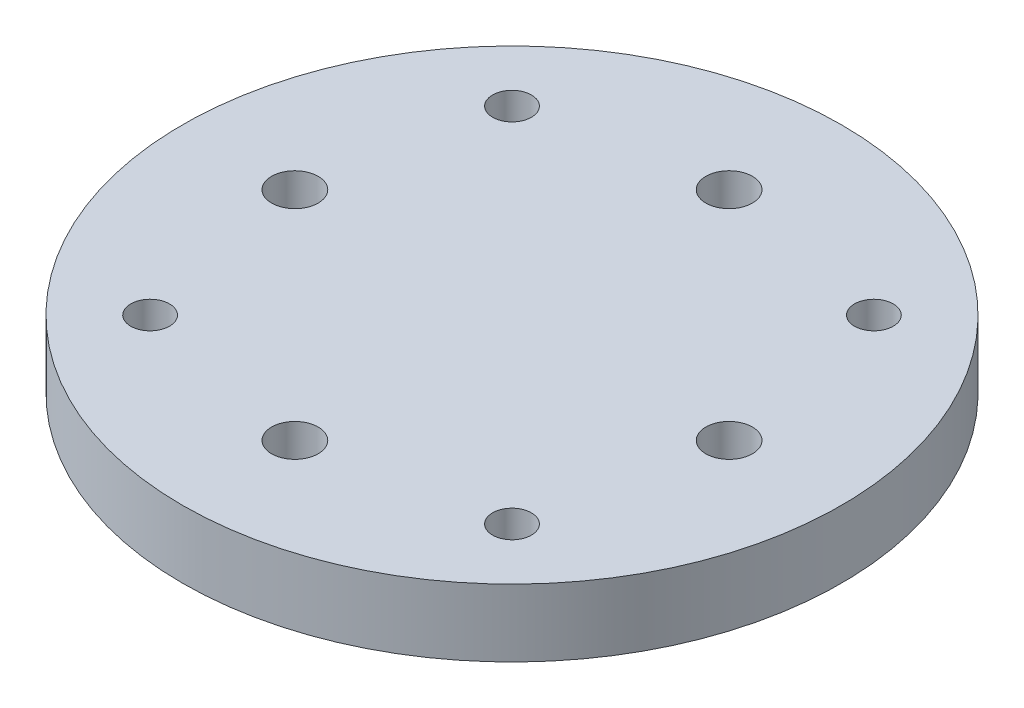
ISO-10303-21;
HEADER;
FILE_DESCRIPTION(('STEP AP214'),'2;1');
FILE_NAME('part.step','',(''),(''),'','','');
FILE_SCHEMA(('AUTOMOTIVE_DESIGN { 1 0 10303 214 1 1 1 1 }'));
ENDSEC;
DATA;
#1=APPLICATION_CONTEXT('core data for automotive mechanical design processes');
#2=APPLICATION_PROTOCOL_DEFINITION('international standard','automotive_design',2000,#1);
#3=PRODUCT_CONTEXT('',#1,'mechanical');
#4=PRODUCT('Part','Part','',(#3));
#5=PRODUCT_RELATED_PRODUCT_CATEGORY('part','',(#4));
#6=PRODUCT_DEFINITION_FORMATION('','',#4);
#7=PRODUCT_DEFINITION_CONTEXT('part definition',#1,'design');
#8=PRODUCT_DEFINITION('design','',#6,#7);
#9=PRODUCT_DEFINITION_SHAPE('','',#8);
#10=(LENGTH_UNIT() NAMED_UNIT(*) SI_UNIT(.MILLI.,.METRE.));
#11=(NAMED_UNIT(*) PLANE_ANGLE_UNIT() SI_UNIT($,.RADIAN.));
#12=(NAMED_UNIT(*) SI_UNIT($,.STERADIAN.) SOLID_ANGLE_UNIT());
#13=UNCERTAINTY_MEASURE_WITH_UNIT(LENGTH_MEASURE(1.E-05),#10,'distance_accuracy_value','');
#14=(GEOMETRIC_REPRESENTATION_CONTEXT(3) GLOBAL_UNCERTAINTY_ASSIGNED_CONTEXT((#13)) GLOBAL_UNIT_ASSIGNED_CONTEXT((#10,
#11,#12)) REPRESENTATION_CONTEXT('',''));
#15=CARTESIAN_POINT('',(0.,0.,0.));
#16=DIRECTION('',(0.,0.,1.));
#17=DIRECTION('',(1.,0.,0.));
#18=AXIS2_PLACEMENT_3D('',#15,#16,#17);
#19=CARTESIAN_POINT('',(0.,8.7,0.));
#20=DIRECTION('',(0.,-1.,0.));
#21=DIRECTION('',(0.,0.,-1.));
#22=AXIS2_PLACEMENT_3D('',#19,#20,#21);
#23=CYLINDRICAL_SURFACE('',#22,42.5);
#24=CARTESIAN_POINT('',(0.,8.7,0.));
#25=DIRECTION('',(0.,1.,0.));
#26=DIRECTION('',(0.,0.,1.));
#27=AXIS2_PLACEMENT_3D('',#24,#25,#26);
#28=CIRCLE('',#27,42.5);
#29=CARTESIAN_POINT('',(0.,8.7,42.5));
#30=VERTEX_POINT('',#29);
#31=EDGE_CURVE('E10',#30,#30,#28,.T.);
#32=ORIENTED_EDGE('',*,*,#31,.F.);
#33=EDGE_LOOP('',(#32));
#34=FACE_BOUND('',#33,.T.);
#35=CARTESIAN_POINT('',(0.,0.,0.));
#36=DIRECTION('',(0.,1.,0.));
#37=DIRECTION('',(0.,0.,1.));
#38=AXIS2_PLACEMENT_3D('',#35,#36,#37);
#39=CIRCLE('',#38,42.5);
#40=CARTESIAN_POINT('',(0.,0.,42.5));
#41=VERTEX_POINT('',#40);
#42=EDGE_CURVE('E32',#41,#41,#39,.T.);
#43=ORIENTED_EDGE('',*,*,#42,.T.);
#44=EDGE_LOOP('',(#43));
#45=FACE_BOUND('',#44,.T.);
#46=ADVANCED_FACE('F29',(#34,#45),#23,.T.);
#47=CARTESIAN_POINT('',(0.,8.7,0.));
#48=DIRECTION('',(0.,1.,0.));
#49=DIRECTION('',(0.,0.,1.));
#50=AXIS2_PLACEMENT_3D('',#47,#48,#49);
#51=PLANE('',#50);
#52=CARTESIAN_POINT('',(-23.3345237791554,8.7,23.334523779156));
#53=DIRECTION('',(0.,1.,0.));
#54=DIRECTION('',(0.,0.,1.));
#55=AXIS2_PLACEMENT_3D('',#52,#53,#54);
#56=CIRCLE('',#55,2.5);
#57=CARTESIAN_POINT('',(-23.3345237791554,8.7,25.834523779156));
#58=VERTEX_POINT('',#57);
#59=EDGE_CURVE('E83',#58,#58,#56,.T.);
#60=ORIENTED_EDGE('',*,*,#59,.F.);
#61=EDGE_LOOP('',(#60));
#62=FACE_BOUND('',#61,.T.);
#63=CARTESIAN_POINT('',(23.3345237791567,8.7,23.3345237791554));
#64=DIRECTION('',(0.,1.,0.));
#65=DIRECTION('',(0.,0.,1.));
#66=AXIS2_PLACEMENT_3D('',#63,#64,#65);
#67=CIRCLE('',#66,2.5);
#68=CARTESIAN_POINT('',(23.3345237791567,8.7,25.8345237791554));
#69=VERTEX_POINT('',#68);
#70=EDGE_CURVE('E77',#69,#69,#67,.T.);
#71=ORIENTED_EDGE('',*,*,#70,.F.);
#72=EDGE_LOOP('',(#71));
#73=FACE_BOUND('',#72,.T.);
#74=CARTESIAN_POINT('',(23.3345237791561,8.7,-23.3345237791567));
#75=DIRECTION('',(0.,1.,0.));
#76=DIRECTION('',(0.,0.,1.));
#77=AXIS2_PLACEMENT_3D('',#74,#75,#76);
#78=CIRCLE('',#77,2.5);
#79=CARTESIAN_POINT('',(23.3345237791561,8.7,-20.8345237791567));
#80=VERTEX_POINT('',#79);
#81=EDGE_CURVE('E71',#80,#80,#78,.T.);
#82=ORIENTED_EDGE('',*,*,#81,.F.);
#83=EDGE_LOOP('',(#82));
#84=FACE_BOUND('',#83,.T.);
#85=CARTESIAN_POINT('',(-23.334523779156,8.7,-23.3345237791561));
#86=DIRECTION('',(0.,1.,0.));
#87=DIRECTION('',(0.,0.,1.));
#88=AXIS2_PLACEMENT_3D('',#85,#86,#87);
#89=CIRCLE('',#88,2.5);
#90=CARTESIAN_POINT('',(-23.334523779156,8.7,-20.8345237791561));
#91=VERTEX_POINT('',#90);
#92=EDGE_CURVE('E65',#91,#91,#89,.T.);
#93=ORIENTED_EDGE('',*,*,#92,.F.);
#94=EDGE_LOOP('',(#93));
#95=FACE_BOUND('',#94,.T.);
#96=CARTESIAN_POINT('',(-27.9999999999996,8.7,3.93769828779805E-13));
#97=DIRECTION('',(0.,1.,0.));
#98=DIRECTION('',(0.,0.,1.));
#99=AXIS2_PLACEMENT_3D('',#96,#97,#98);
#100=CIRCLE('',#99,3.00000000000077);
#101=CARTESIAN_POINT('',(-27.9999999999996,8.7,3.00000000000117));
#102=VERTEX_POINT('',#101);
#103=EDGE_CURVE('E59',#102,#102,#100,.T.);
#104=ORIENTED_EDGE('',*,*,#103,.F.);
#105=EDGE_LOOP('',(#104));
#106=FACE_BOUND('',#105,.T.);
#107=CARTESIAN_POINT('',(7.94397679634836E-13,8.7,28.));
#108=DIRECTION('',(0.,1.,0.));
#109=DIRECTION('',(0.,0.,1.));
#110=AXIS2_PLACEMENT_3D('',#107,#108,#109);
#111=CIRCLE('',#110,3.00000000000077);
#112=CARTESIAN_POINT('',(7.94397679634836E-13,8.7,31.0000000000008));
#113=VERTEX_POINT('',#112);
#114=EDGE_CURVE('E53',#113,#113,#111,.T.);
#115=ORIENTED_EDGE('',*,*,#114,.F.);
#116=EDGE_LOOP('',(#115));
#117=FACE_BOUND('',#116,.T.);
#118=CARTESIAN_POINT('',(28.0000000000004,8.7,-3.97198839817418E-13));
#119=DIRECTION('',(0.,1.,0.));
#120=DIRECTION('',(0.,0.,1.));
#121=AXIS2_PLACEMENT_3D('',#118,#119,#120);
#122=CIRCLE('',#121,3.00000000000077);
#123=CARTESIAN_POINT('',(28.0000000000004,8.7,3.00000000000038));
#124=VERTEX_POINT('',#123);
#125=EDGE_CURVE('E47',#124,#124,#122,.T.);
#126=ORIENTED_EDGE('',*,*,#125,.F.);
#127=EDGE_LOOP('',(#126));
#128=FACE_BOUND('',#127,.T.);
#129=CARTESIAN_POINT('',(0.,8.7,-28.));
#130=DIRECTION('',(0.,1.,0.));
#131=DIRECTION('',(0.,0.,1.));
#132=AXIS2_PLACEMENT_3D('',#129,#130,#131);
#133=CIRCLE('',#132,3.00000000000077);
#134=CARTESIAN_POINT('',(0.,8.7,-24.9999999999992));
#135=VERTEX_POINT('',#134);
#136=EDGE_CURVE('E41',#135,#135,#133,.T.);
#137=ORIENTED_EDGE('',*,*,#136,.F.);
#138=EDGE_LOOP('',(#137));
#139=FACE_BOUND('',#138,.T.);
#140=ORIENTED_EDGE('',*,*,#31,.T.);
#141=EDGE_LOOP('',(#140));
#142=FACE_BOUND('',#141,.T.);
#143=ADVANCED_FACE('F99',(#62,#73,#84,#95,#106,#117,#128,#139,#142),#51,.T.);
#144=CARTESIAN_POINT('',(0.,0.,0.));
#145=DIRECTION('',(0.,1.,0.));
#146=DIRECTION('',(0.,0.,1.));
#147=AXIS2_PLACEMENT_3D('',#144,#145,#146);
#148=PLANE('',#147);
#149=CARTESIAN_POINT('',(-23.3345237791554,0.,23.334523779156));
#150=DIRECTION('',(0.,1.,0.));
#151=DIRECTION('',(0.,0.,1.));
#152=AXIS2_PLACEMENT_3D('',#149,#150,#151);
#153=CIRCLE('',#152,2.5);
#154=CARTESIAN_POINT('',(-23.3345237791554,0.,25.834523779156));
#155=VERTEX_POINT('',#154);
#156=EDGE_CURVE('E80',#155,#155,#153,.T.);
#157=ORIENTED_EDGE('',*,*,#156,.T.);
#158=EDGE_LOOP('',(#157));
#159=FACE_BOUND('',#158,.T.);
#160=CARTESIAN_POINT('',(23.3345237791567,0.,23.3345237791554));
#161=DIRECTION('',(0.,1.,0.));
#162=DIRECTION('',(0.,0.,1.));
#163=AXIS2_PLACEMENT_3D('',#160,#161,#162);
#164=CIRCLE('',#163,2.5);
#165=CARTESIAN_POINT('',(23.3345237791567,0.,25.8345237791554));
#166=VERTEX_POINT('',#165);
#167=EDGE_CURVE('E74',#166,#166,#164,.T.);
#168=ORIENTED_EDGE('',*,*,#167,.T.);
#169=EDGE_LOOP('',(#168));
#170=FACE_BOUND('',#169,.T.);
#171=CARTESIAN_POINT('',(23.3345237791561,0.,-23.3345237791567));
#172=DIRECTION('',(0.,1.,0.));
#173=DIRECTION('',(0.,0.,1.));
#174=AXIS2_PLACEMENT_3D('',#171,#172,#173);
#175=CIRCLE('',#174,2.5);
#176=CARTESIAN_POINT('',(23.3345237791561,0.,-20.8345237791567));
#177=VERTEX_POINT('',#176);
#178=EDGE_CURVE('E68',#177,#177,#175,.T.);
#179=ORIENTED_EDGE('',*,*,#178,.T.);
#180=EDGE_LOOP('',(#179));
#181=FACE_BOUND('',#180,.T.);
#182=CARTESIAN_POINT('',(-23.334523779156,0.,-23.3345237791561));
#183=DIRECTION('',(0.,1.,0.));
#184=DIRECTION('',(0.,0.,1.));
#185=AXIS2_PLACEMENT_3D('',#182,#183,#184);
#186=CIRCLE('',#185,2.5);
#187=CARTESIAN_POINT('',(-23.334523779156,0.,-20.8345237791561));
#188=VERTEX_POINT('',#187);
#189=EDGE_CURVE('E62',#188,#188,#186,.T.);
#190=ORIENTED_EDGE('',*,*,#189,.T.);
#191=EDGE_LOOP('',(#190));
#192=FACE_BOUND('',#191,.T.);
#193=CARTESIAN_POINT('',(-27.9999999999996,0.,3.93769828779805E-13));
#194=DIRECTION('',(0.,1.,0.));
#195=DIRECTION('',(0.,0.,1.));
#196=AXIS2_PLACEMENT_3D('',#193,#194,#195);
#197=CIRCLE('',#196,3.00000000000077);
#198=CARTESIAN_POINT('',(-27.9999999999996,0.,3.00000000000117));
#199=VERTEX_POINT('',#198);
#200=EDGE_CURVE('E56',#199,#199,#197,.T.);
#201=ORIENTED_EDGE('',*,*,#200,.T.);
#202=EDGE_LOOP('',(#201));
#203=FACE_BOUND('',#202,.T.);
#204=CARTESIAN_POINT('',(7.94397679634836E-13,0.,28.));
#205=DIRECTION('',(0.,1.,0.));
#206=DIRECTION('',(0.,0.,1.));
#207=AXIS2_PLACEMENT_3D('',#204,#205,#206);
#208=CIRCLE('',#207,3.00000000000077);
#209=CARTESIAN_POINT('',(7.94397679634836E-13,0.,31.0000000000008));
#210=VERTEX_POINT('',#209);
#211=EDGE_CURVE('E50',#210,#210,#208,.T.);
#212=ORIENTED_EDGE('',*,*,#211,.T.);
#213=EDGE_LOOP('',(#212));
#214=FACE_BOUND('',#213,.T.);
#215=CARTESIAN_POINT('',(28.0000000000004,0.,-3.97198839817418E-13));
#216=DIRECTION('',(0.,1.,0.));
#217=DIRECTION('',(0.,0.,1.));
#218=AXIS2_PLACEMENT_3D('',#215,#216,#217);
#219=CIRCLE('',#218,3.00000000000077);
#220=CARTESIAN_POINT('',(28.0000000000004,0.,3.00000000000038));
#221=VERTEX_POINT('',#220);
#222=EDGE_CURVE('E44',#221,#221,#219,.T.);
#223=ORIENTED_EDGE('',*,*,#222,.T.);
#224=EDGE_LOOP('',(#223));
#225=FACE_BOUND('',#224,.T.);
#226=CARTESIAN_POINT('',(0.,0.,-28.));
#227=DIRECTION('',(0.,1.,0.));
#228=DIRECTION('',(0.,0.,1.));
#229=AXIS2_PLACEMENT_3D('',#226,#227,#228);
#230=CIRCLE('',#229,3.00000000000077);
#231=CARTESIAN_POINT('',(0.,0.,-24.9999999999992));
#232=VERTEX_POINT('',#231);
#233=EDGE_CURVE('E39',#232,#232,#230,.T.);
#234=ORIENTED_EDGE('',*,*,#233,.T.);
#235=EDGE_LOOP('',(#234));
#236=FACE_BOUND('',#235,.T.);
#237=ORIENTED_EDGE('',*,*,#42,.F.);
#238=EDGE_LOOP('',(#237));
#239=FACE_BOUND('',#238,.T.);
#240=ADVANCED_FACE('F89',(#159,#170,#181,#192,#203,#214,#225,#236,#239),#148,.F.);
#241=CARTESIAN_POINT('',(0.,0.,-28.));
#242=DIRECTION('',(0.,1.,0.));
#243=DIRECTION('',(0.,0.,1.));
#244=AXIS2_PLACEMENT_3D('',#241,#242,#243);
#245=CYLINDRICAL_SURFACE('',#244,3.00000000000077);
#246=ORIENTED_EDGE('',*,*,#233,.F.);
#247=EDGE_LOOP('',(#246));
#248=FACE_BOUND('',#247,.T.);
#249=ORIENTED_EDGE('',*,*,#136,.T.);
#250=EDGE_LOOP('',(#249));
#251=FACE_BOUND('',#250,.T.);
#252=ADVANCED_FACE('F117',(#248,#251),#245,.F.);
#253=CARTESIAN_POINT('',(28.0000000000004,0.,-3.97198839817418E-13));
#254=DIRECTION('',(0.,1.,0.));
#255=DIRECTION('',(0.,0.,1.));
#256=AXIS2_PLACEMENT_3D('',#253,#254,#255);
#257=CYLINDRICAL_SURFACE('',#256,3.00000000000077);
#258=ORIENTED_EDGE('',*,*,#222,.F.);
#259=EDGE_LOOP('',(#258));
#260=FACE_BOUND('',#259,.T.);
#261=ORIENTED_EDGE('',*,*,#125,.T.);
#262=EDGE_LOOP('',(#261));
#263=FACE_BOUND('',#262,.T.);
#264=ADVANCED_FACE('F119',(#260,#263),#257,.F.);
#265=CARTESIAN_POINT('',(7.94397679634836E-13,0.,28.));
#266=DIRECTION('',(0.,1.,0.));
#267=DIRECTION('',(0.,0.,1.));
#268=AXIS2_PLACEMENT_3D('',#265,#266,#267);
#269=CYLINDRICAL_SURFACE('',#268,3.00000000000077);
#270=ORIENTED_EDGE('',*,*,#211,.F.);
#271=EDGE_LOOP('',(#270));
#272=FACE_BOUND('',#271,.T.);
#273=ORIENTED_EDGE('',*,*,#114,.T.);
#274=EDGE_LOOP('',(#273));
#275=FACE_BOUND('',#274,.T.);
#276=ADVANCED_FACE('F126',(#272,#275),#269,.F.);
#277=CARTESIAN_POINT('',(-27.9999999999996,0.,3.93769828779805E-13));
#278=DIRECTION('',(0.,1.,0.));
#279=DIRECTION('',(0.,0.,1.));
#280=AXIS2_PLACEMENT_3D('',#277,#278,#279);
#281=CYLINDRICAL_SURFACE('',#280,3.00000000000077);
#282=ORIENTED_EDGE('',*,*,#200,.F.);
#283=EDGE_LOOP('',(#282));
#284=FACE_BOUND('',#283,.T.);
#285=ORIENTED_EDGE('',*,*,#103,.T.);
#286=EDGE_LOOP('',(#285));
#287=FACE_BOUND('',#286,.T.);
#288=ADVANCED_FACE('F164',(#284,#287),#281,.F.);
#289=CARTESIAN_POINT('',(-23.334523779156,0.,-23.3345237791561));
#290=DIRECTION('',(0.,1.,0.));
#291=DIRECTION('',(0.,0.,1.));
#292=AXIS2_PLACEMENT_3D('',#289,#290,#291);
#293=CYLINDRICAL_SURFACE('',#292,2.5);
#294=ORIENTED_EDGE('',*,*,#189,.F.);
#295=EDGE_LOOP('',(#294));
#296=FACE_BOUND('',#295,.T.);
#297=ORIENTED_EDGE('',*,*,#92,.T.);
#298=EDGE_LOOP('',(#297));
#299=FACE_BOUND('',#298,.T.);
#300=ADVANCED_FACE('F174',(#296,#299),#293,.F.);
#301=CARTESIAN_POINT('',(23.3345237791561,0.,-23.3345237791567));
#302=DIRECTION('',(0.,1.,0.));
#303=DIRECTION('',(0.,0.,1.));
#304=AXIS2_PLACEMENT_3D('',#301,#302,#303);
#305=CYLINDRICAL_SURFACE('',#304,2.5);
#306=ORIENTED_EDGE('',*,*,#178,.F.);
#307=EDGE_LOOP('',(#306));
#308=FACE_BOUND('',#307,.T.);
#309=ORIENTED_EDGE('',*,*,#81,.T.);
#310=EDGE_LOOP('',(#309));
#311=FACE_BOUND('',#310,.T.);
#312=ADVANCED_FACE('F184',(#308,#311),#305,.F.);
#313=CARTESIAN_POINT('',(23.3345237791567,0.,23.3345237791554));
#314=DIRECTION('',(0.,1.,0.));
#315=DIRECTION('',(0.,0.,1.));
#316=AXIS2_PLACEMENT_3D('',#313,#314,#315);
#317=CYLINDRICAL_SURFACE('',#316,2.5);
#318=ORIENTED_EDGE('',*,*,#167,.F.);
#319=EDGE_LOOP('',(#318));
#320=FACE_BOUND('',#319,.T.);
#321=ORIENTED_EDGE('',*,*,#70,.T.);
#322=EDGE_LOOP('',(#321));
#323=FACE_BOUND('',#322,.T.);
#324=ADVANCED_FACE('F95',(#320,#323),#317,.F.);
#325=CARTESIAN_POINT('',(-23.3345237791554,0.,23.334523779156));
#326=DIRECTION('',(0.,1.,0.));
#327=DIRECTION('',(0.,0.,1.));
#328=AXIS2_PLACEMENT_3D('',#325,#326,#327);
#329=CYLINDRICAL_SURFACE('',#328,2.5);
#330=ORIENTED_EDGE('',*,*,#156,.F.);
#331=EDGE_LOOP('',(#330));
#332=FACE_BOUND('',#331,.T.);
#333=ORIENTED_EDGE('',*,*,#59,.T.);
#334=EDGE_LOOP('',(#333));
#335=FACE_BOUND('',#334,.T.);
#336=ADVANCED_FACE('F92',(#332,#335),#329,.F.);
#337=CLOSED_SHELL('',(#46,#143,#240,#252,#264,#276,#288,#300,#312,#324,#336));
#338=MANIFOLD_SOLID_BREP('B2',#337);
#339=ADVANCED_BREP_SHAPE_REPRESENTATION('',(#18,#338),#14);
#340=SHAPE_DEFINITION_REPRESENTATION(#9,#339);
ENDSEC;
END-ISO-10303-21;
